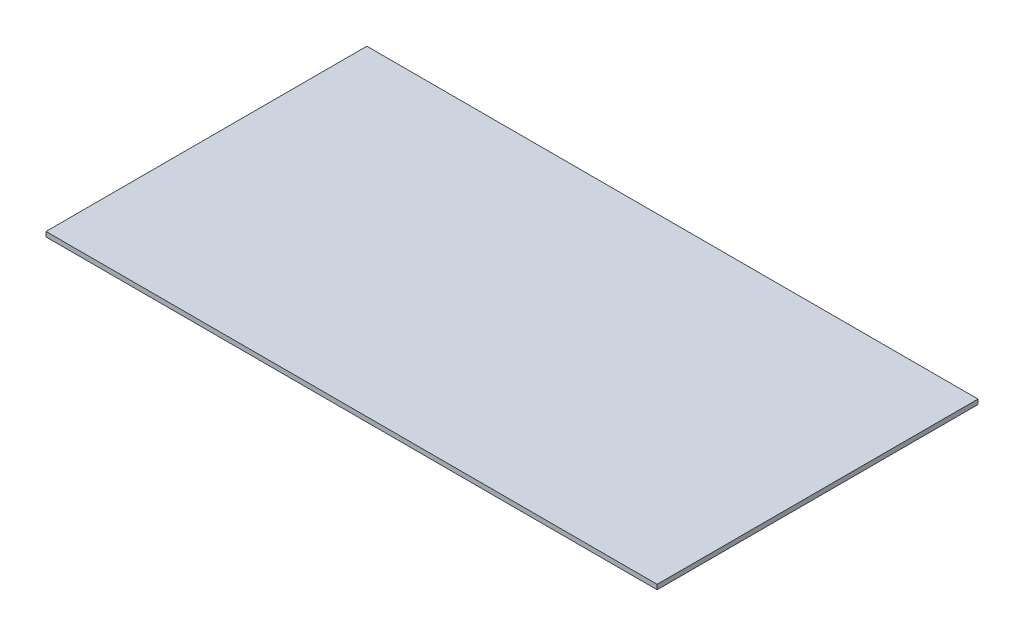
ISO-10303-21;
HEADER;
FILE_DESCRIPTION(('STEP AP214'),'2;1');
FILE_NAME('part.step','',(''),(''),'','','');
FILE_SCHEMA(('AUTOMOTIVE_DESIGN { 1 0 10303 214 1 1 1 1 }'));
ENDSEC;
DATA;
#1=APPLICATION_CONTEXT('core data for automotive mechanical design processes');
#2=APPLICATION_PROTOCOL_DEFINITION('international standard','automotive_design',2000,#1);
#3=PRODUCT_CONTEXT('',#1,'mechanical');
#4=PRODUCT('Part','Part','',(#3));
#5=PRODUCT_RELATED_PRODUCT_CATEGORY('part','',(#4));
#6=PRODUCT_DEFINITION_FORMATION('','',#4);
#7=PRODUCT_DEFINITION_CONTEXT('part definition',#1,'design');
#8=PRODUCT_DEFINITION('design','',#6,#7);
#9=PRODUCT_DEFINITION_SHAPE('','',#8);
#10=(LENGTH_UNIT() NAMED_UNIT(*) SI_UNIT(.MILLI.,.METRE.));
#11=(NAMED_UNIT(*) PLANE_ANGLE_UNIT() SI_UNIT($,.RADIAN.));
#12=(NAMED_UNIT(*) SI_UNIT($,.STERADIAN.) SOLID_ANGLE_UNIT());
#13=UNCERTAINTY_MEASURE_WITH_UNIT(LENGTH_MEASURE(1.E-05),#10,'distance_accuracy_value','');
#14=(GEOMETRIC_REPRESENTATION_CONTEXT(3) GLOBAL_UNCERTAINTY_ASSIGNED_CONTEXT((#13)) GLOBAL_UNIT_ASSIGNED_CONTEXT((#10,
#11,#12)) REPRESENTATION_CONTEXT('',''));
#15=CARTESIAN_POINT('',(0.,0.,0.));
#16=DIRECTION('',(0.,0.,1.));
#17=DIRECTION('',(1.,0.,0.));
#18=AXIS2_PLACEMENT_3D('',#15,#16,#17);
#19=CARTESIAN_POINT('',(-26.7628894754107,0.25,-18.9979472412302));
#20=DIRECTION('',(1.,0.,0.));
#21=DIRECTION('',(0.,0.,-1.));
#22=AXIS2_PLACEMENT_3D('',#19,#20,#21);
#23=PLANE('',#22);
#24=DIRECTION('',(0.,0.,1.));
#25=VECTOR('',#24,1.);
#26=CARTESIAN_POINT('',(-26.7628894754107,0.,-18.9979472412302));
#27=LINE('',#26,#25);
#28=CARTESIAN_POINT('',(-26.7628894754107,0.,-18.9979472412302));
#29=VERTEX_POINT('',#28);
#30=CARTESIAN_POINT('',(-26.7628894754107,0.,-2.19794724123024));
#31=VERTEX_POINT('',#30);
#32=EDGE_CURVE('E107',#29,#31,#27,.T.);
#33=ORIENTED_EDGE('',*,*,#32,.T.);
#34=DIRECTION('',(0.,-1.,0.));
#35=VECTOR('',#34,1.);
#36=CARTESIAN_POINT('',(-26.7628894754107,0.25,-2.19794724123024));
#37=LINE('',#36,#35);
#38=CARTESIAN_POINT('',(-26.7628894754107,0.25,-2.19794724123024));
#39=VERTEX_POINT('',#38);
#40=EDGE_CURVE('E11',#39,#31,#37,.T.);
#41=ORIENTED_EDGE('',*,*,#40,.F.);
#42=DIRECTION('',(0.,0.,1.));
#43=VECTOR('',#42,1.);
#44=CARTESIAN_POINT('',(-26.7628894754107,0.25,-18.9979472412302));
#45=LINE('',#44,#43);
#46=CARTESIAN_POINT('',(-26.7628894754107,0.25,-18.9979472412302));
#47=VERTEX_POINT('',#46);
#48=EDGE_CURVE('E91',#47,#39,#45,.T.);
#49=ORIENTED_EDGE('',*,*,#48,.F.);
#50=DIRECTION('',(0.,-1.,0.));
#51=VECTOR('',#50,1.);
#52=CARTESIAN_POINT('',(-26.7628894754107,0.25,-18.9979472412302));
#53=LINE('',#52,#51);
#54=EDGE_CURVE('E103',#47,#29,#53,.T.);
#55=ORIENTED_EDGE('',*,*,#54,.T.);
#56=EDGE_LOOP('',(#33,#41,#49,#55));
#57=FACE_BOUND('',#56,.T.);
#58=ADVANCED_FACE('F39',(#57),#23,.F.);
#59=CARTESIAN_POINT('',(-26.7628894754107,0.25,-2.19794724123024));
#60=DIRECTION('',(0.,0.,-1.));
#61=DIRECTION('',(-1.,0.,0.));
#62=AXIS2_PLACEMENT_3D('',#59,#60,#61);
#63=PLANE('',#62);
#64=DIRECTION('',(1.,0.,0.));
#65=VECTOR('',#64,1.);
#66=CARTESIAN_POINT('',(-26.7628894754107,0.,-2.19794724123024));
#67=LINE('',#66,#65);
#68=CARTESIAN_POINT('',(5.23711052458929,0.,-2.19794724123024));
#69=VERTEX_POINT('',#68);
#70=EDGE_CURVE('E96',#31,#69,#67,.T.);
#71=ORIENTED_EDGE('',*,*,#70,.T.);
#72=DIRECTION('',(0.,-1.,0.));
#73=VECTOR('',#72,1.);
#74=CARTESIAN_POINT('',(5.23711052458929,0.25,-2.19794724123024));
#75=LINE('',#74,#73);
#76=CARTESIAN_POINT('',(5.23711052458929,0.25,-2.19794724123024));
#77=VERTEX_POINT('',#76);
#78=EDGE_CURVE('E48',#77,#69,#75,.T.);
#79=ORIENTED_EDGE('',*,*,#78,.F.);
#80=DIRECTION('',(1.,0.,0.));
#81=VECTOR('',#80,1.);
#82=CARTESIAN_POINT('',(-26.7628894754107,0.25,-2.19794724123024));
#83=LINE('',#82,#81);
#84=EDGE_CURVE('E86',#39,#77,#83,.T.);
#85=ORIENTED_EDGE('',*,*,#84,.F.);
#86=ORIENTED_EDGE('',*,*,#40,.T.);
#87=EDGE_LOOP('',(#71,#79,#85,#86));
#88=FACE_BOUND('',#87,.T.);
#89=ADVANCED_FACE('F95',(#88),#63,.F.);
#90=CARTESIAN_POINT('',(5.23711052458929,0.25,-18.9979472412302));
#91=DIRECTION('',(-1.,0.,0.));
#92=DIRECTION('',(0.,0.,1.));
#93=AXIS2_PLACEMENT_3D('',#90,#91,#92);
#94=PLANE('',#93);
#95=DIRECTION('',(0.,0.,-1.));
#96=VECTOR('',#95,1.);
#97=CARTESIAN_POINT('',(5.23711052458929,0.,-18.9979472412302));
#98=LINE('',#97,#96);
#99=CARTESIAN_POINT('',(5.23711052458929,0.,-18.9979472412302));
#100=VERTEX_POINT('',#99);
#101=EDGE_CURVE('E73',#69,#100,#98,.T.);
#102=ORIENTED_EDGE('',*,*,#101,.T.);
#103=DIRECTION('',(0.,-1.,0.));
#104=VECTOR('',#103,1.);
#105=CARTESIAN_POINT('',(5.23711052458929,0.25,-18.9979472412302));
#106=LINE('',#105,#104);
#107=CARTESIAN_POINT('',(5.23711052458929,0.25,-18.9979472412302));
#108=VERTEX_POINT('',#107);
#109=EDGE_CURVE('E98',#108,#100,#106,.T.);
#110=ORIENTED_EDGE('',*,*,#109,.F.);
#111=DIRECTION('',(0.,0.,-1.));
#112=VECTOR('',#111,1.);
#113=CARTESIAN_POINT('',(5.23711052458929,0.25,-18.9979472412302));
#114=LINE('',#113,#112);
#115=EDGE_CURVE('E89',#77,#108,#114,.T.);
#116=ORIENTED_EDGE('',*,*,#115,.F.);
#117=ORIENTED_EDGE('',*,*,#78,.T.);
#118=EDGE_LOOP('',(#102,#110,#116,#117));
#119=FACE_BOUND('',#118,.T.);
#120=ADVANCED_FACE('F99',(#119),#94,.F.);
#121=CARTESIAN_POINT('',(-26.7628894754107,0.25,-18.9979472412302));
#122=DIRECTION('',(0.,0.,1.));
#123=DIRECTION('',(1.,0.,0.));
#124=AXIS2_PLACEMENT_3D('',#121,#122,#123);
#125=PLANE('',#124);
#126=DIRECTION('',(-1.,0.,0.));
#127=VECTOR('',#126,1.);
#128=CARTESIAN_POINT('',(-26.7628894754107,0.,-18.9979472412302));
#129=LINE('',#128,#127);
#130=EDGE_CURVE('E79',#100,#29,#129,.T.);
#131=ORIENTED_EDGE('',*,*,#130,.T.);
#132=ORIENTED_EDGE('',*,*,#54,.F.);
#133=DIRECTION('',(-1.,0.,0.));
#134=VECTOR('',#133,1.);
#135=CARTESIAN_POINT('',(-26.7628894754107,0.25,-18.9979472412302));
#136=LINE('',#135,#134);
#137=EDGE_CURVE('E56',#108,#47,#136,.T.);
#138=ORIENTED_EDGE('',*,*,#137,.F.);
#139=ORIENTED_EDGE('',*,*,#109,.T.);
#140=EDGE_LOOP('',(#131,#132,#138,#139));
#141=FACE_BOUND('',#140,.T.);
#142=ADVANCED_FACE('F120',(#141),#125,.F.);
#143=CARTESIAN_POINT('',(0.,0.25,0.));
#144=DIRECTION('',(0.,1.,0.));
#145=DIRECTION('',(0.,0.,1.));
#146=AXIS2_PLACEMENT_3D('',#143,#144,#145);
#147=PLANE('',#146);
#148=ORIENTED_EDGE('',*,*,#48,.T.);
#149=ORIENTED_EDGE('',*,*,#84,.T.);
#150=ORIENTED_EDGE('',*,*,#115,.T.);
#151=ORIENTED_EDGE('',*,*,#137,.T.);
#152=EDGE_LOOP('',(#148,#149,#150,#151));
#153=FACE_BOUND('',#152,.T.);
#154=ADVANCED_FACE('F87',(#153),#147,.T.);
#155=CARTESIAN_POINT('',(0.,0.,0.));
#156=DIRECTION('',(0.,1.,0.));
#157=DIRECTION('',(0.,0.,1.));
#158=AXIS2_PLACEMENT_3D('',#155,#156,#157);
#159=PLANE('',#158);
#160=ORIENTED_EDGE('',*,*,#32,.F.);
#161=ORIENTED_EDGE('',*,*,#130,.F.);
#162=ORIENTED_EDGE('',*,*,#101,.F.);
#163=ORIENTED_EDGE('',*,*,#70,.F.);
#164=EDGE_LOOP('',(#160,#161,#162,#163));
#165=FACE_BOUND('',#164,.T.);
#166=ADVANCED_FACE('F123',(#165),#159,.F.);
#167=CLOSED_SHELL('',(#58,#89,#120,#142,#154,#166));
#168=MANIFOLD_SOLID_BREP('B2',#167);
#169=ADVANCED_BREP_SHAPE_REPRESENTATION('',(#18,#168),#14);
#170=SHAPE_DEFINITION_REPRESENTATION(#9,#169);
ENDSEC;
END-ISO-10303-21;
